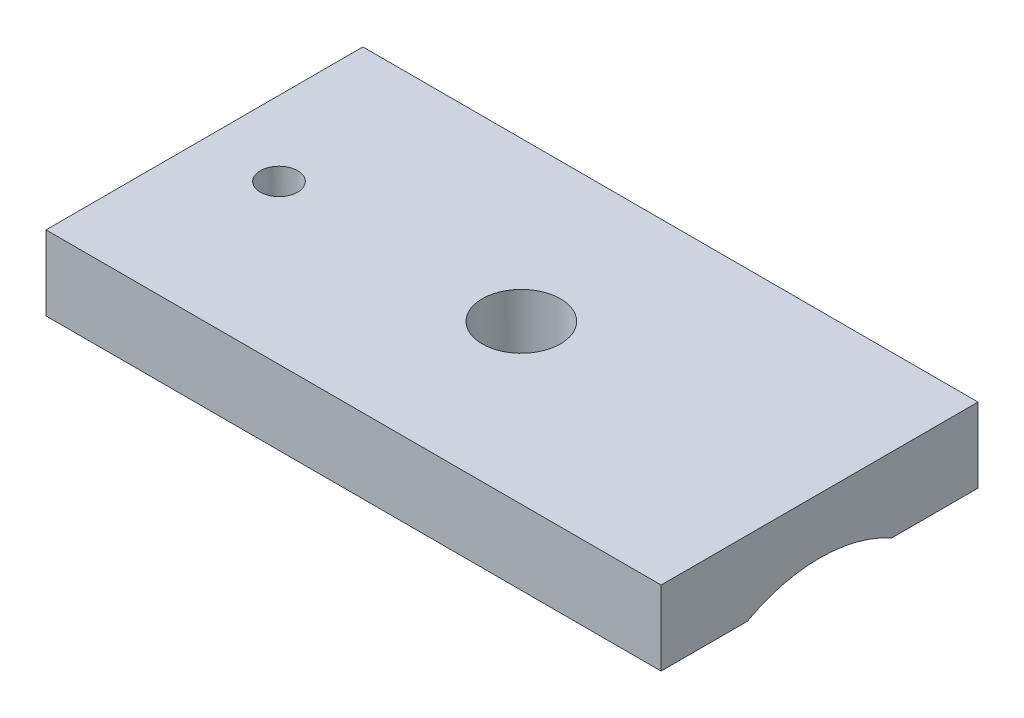
ISO-10303-21;
HEADER;
FILE_DESCRIPTION(('STEP AP214'),'2;1');
FILE_NAME('part.step','',(''),(''),'','','');
FILE_SCHEMA(('AUTOMOTIVE_DESIGN { 1 0 10303 214 1 1 1 1 }'));
ENDSEC;
DATA;
#1=APPLICATION_CONTEXT('core data for automotive mechanical design processes');
#2=APPLICATION_PROTOCOL_DEFINITION('international standard','automotive_design',2000,#1);
#3=PRODUCT_CONTEXT('',#1,'mechanical');
#4=PRODUCT('Part','Part','',(#3));
#5=PRODUCT_RELATED_PRODUCT_CATEGORY('part','',(#4));
#6=PRODUCT_DEFINITION_FORMATION('','',#4);
#7=PRODUCT_DEFINITION_CONTEXT('part definition',#1,'design');
#8=PRODUCT_DEFINITION('design','',#6,#7);
#9=PRODUCT_DEFINITION_SHAPE('','',#8);
#10=(LENGTH_UNIT() NAMED_UNIT(*) SI_UNIT(.MILLI.,.METRE.));
#11=(NAMED_UNIT(*) PLANE_ANGLE_UNIT() SI_UNIT($,.RADIAN.));
#12=(NAMED_UNIT(*) SI_UNIT($,.STERADIAN.) SOLID_ANGLE_UNIT());
#13=UNCERTAINTY_MEASURE_WITH_UNIT(LENGTH_MEASURE(1.E-05),#10,'distance_accuracy_value','');
#14=(GEOMETRIC_REPRESENTATION_CONTEXT(3) GLOBAL_UNCERTAINTY_ASSIGNED_CONTEXT((#13)) GLOBAL_UNIT_ASSIGNED_CONTEXT((#10,
#11,#12)) REPRESENTATION_CONTEXT('',''));
#15=CARTESIAN_POINT('',(0.,0.,0.));
#16=DIRECTION('',(0.,0.,1.));
#17=DIRECTION('',(1.,0.,0.));
#18=AXIS2_PLACEMENT_3D('',#15,#16,#17);
#19=CARTESIAN_POINT('',(0.,-2.,0.));
#20=DIRECTION('',(0.,1.,0.));
#21=DIRECTION('',(0.,0.,1.));
#22=AXIS2_PLACEMENT_3D('',#19,#20,#21);
#23=PLANE('',#22);
#24=DIRECTION('',(0.,0.,1.));
#25=VECTOR('',#24,1.);
#26=CARTESIAN_POINT('',(-16.5,-2.,8.50000000000001));
#27=LINE('',#26,#25);
#28=CARTESIAN_POINT('',(-16.5,-2.,3.87298334620742));
#29=VERTEX_POINT('',#28);
#30=CARTESIAN_POINT('',(-16.5,-2.,8.50000000000001));
#31=VERTEX_POINT('',#30);
#32=EDGE_CURVE('E115',#29,#31,#27,.T.);
#33=ORIENTED_EDGE('',*,*,#32,.F.);
#34=DIRECTION('',(1.,0.,0.));
#35=VECTOR('',#34,1.);
#36=CARTESIAN_POINT('',(-16.5,-2.,3.87298334620742));
#37=LINE('',#36,#35);
#38=CARTESIAN_POINT('',(16.5,-2.,3.87298334620742));
#39=VERTEX_POINT('',#38);
#40=EDGE_CURVE('E101',#29,#39,#37,.T.);
#41=ORIENTED_EDGE('',*,*,#40,.T.);
#42=DIRECTION('',(0.,0.,-1.));
#43=VECTOR('',#42,1.);
#44=CARTESIAN_POINT('',(16.5,-2.,8.5));
#45=LINE('',#44,#43);
#46=CARTESIAN_POINT('',(16.5,-2.,8.5));
#47=VERTEX_POINT('',#46);
#48=EDGE_CURVE('E130',#47,#39,#45,.T.);
#49=ORIENTED_EDGE('',*,*,#48,.F.);
#50=DIRECTION('',(1.,0.,0.));
#51=VECTOR('',#50,1.);
#52=CARTESIAN_POINT('',(16.5,-2.,8.5));
#53=LINE('',#52,#51);
#54=EDGE_CURVE('E120',#31,#47,#53,.T.);
#55=ORIENTED_EDGE('',*,*,#54,.F.);
#56=EDGE_LOOP('',(#33,#41,#49,#55));
#57=FACE_BOUND('',#56,.T.);
#58=ADVANCED_FACE('F36',(#57),#23,.F.);
#59=CARTESIAN_POINT('',(-16.5,2.,8.50000000000001));
#60=DIRECTION('',(1.,0.,0.));
#61=DIRECTION('',(0.,0.,-1.));
#62=AXIS2_PLACEMENT_3D('',#59,#60,#61);
#63=PLANE('',#62);
#64=CARTESIAN_POINT('',(-16.5,-2.,-8.49999999999999));
#65=VERTEX_POINT('',#64);
#66=CARTESIAN_POINT('',(-16.5,-2.,-3.87298334620742));
#67=VERTEX_POINT('',#66);
#68=EDGE_CURVE('E118',#65,#67,#27,.T.);
#69=ORIENTED_EDGE('',*,*,#68,.T.);
#70=CARTESIAN_POINT('',(-16.5,-9.,0.));
#71=DIRECTION('',(1.,0.,0.));
#72=DIRECTION('',(0.,0.,-1.));
#73=AXIS2_PLACEMENT_3D('',#70,#71,#72);
#74=CIRCLE('',#73,8.);
#75=EDGE_CURVE('E56',#67,#29,#74,.T.);
#76=ORIENTED_EDGE('',*,*,#75,.T.);
#77=ORIENTED_EDGE('',*,*,#32,.T.);
#78=DIRECTION('',(0.,-1.,0.));
#79=VECTOR('',#78,1.);
#80=CARTESIAN_POINT('',(-16.5,2.,8.50000000000001));
#81=LINE('',#80,#79);
#82=CARTESIAN_POINT('',(-16.5,2.,8.50000000000001));
#83=VERTEX_POINT('',#82);
#84=EDGE_CURVE('E11',#83,#31,#81,.T.);
#85=ORIENTED_EDGE('',*,*,#84,.F.);
#86=DIRECTION('',(0.,0.,1.));
#87=VECTOR('',#86,1.);
#88=CARTESIAN_POINT('',(-16.5,2.,8.50000000000001));
#89=LINE('',#88,#87);
#90=CARTESIAN_POINT('',(-16.5,2.,-8.49999999999999));
#91=VERTEX_POINT('',#90);
#92=EDGE_CURVE('E133',#91,#83,#89,.T.);
#93=ORIENTED_EDGE('',*,*,#92,.F.);
#94=DIRECTION('',(0.,-1.,0.));
#95=VECTOR('',#94,1.);
#96=CARTESIAN_POINT('',(-16.5,2.,-8.49999999999999));
#97=LINE('',#96,#95);
#98=EDGE_CURVE('E134',#91,#65,#97,.T.);
#99=ORIENTED_EDGE('',*,*,#98,.T.);
#100=EDGE_LOOP('',(#69,#76,#77,#85,#93,#99));
#101=FACE_BOUND('',#100,.T.);
#102=ADVANCED_FACE('F38',(#101),#63,.F.);
#103=CARTESIAN_POINT('',(16.5,2.,8.5));
#104=DIRECTION('',(0.,0.,-1.));
#105=DIRECTION('',(-1.,0.,0.));
#106=AXIS2_PLACEMENT_3D('',#103,#104,#105);
#107=PLANE('',#106);
#108=ORIENTED_EDGE('',*,*,#54,.T.);
#109=DIRECTION('',(0.,-1.,0.));
#110=VECTOR('',#109,1.);
#111=CARTESIAN_POINT('',(16.5,2.,8.5));
#112=LINE('',#111,#110);
#113=CARTESIAN_POINT('',(16.5,2.,8.5));
#114=VERTEX_POINT('',#113);
#115=EDGE_CURVE('E49',#114,#47,#112,.T.);
#116=ORIENTED_EDGE('',*,*,#115,.F.);
#117=DIRECTION('',(1.,0.,0.));
#118=VECTOR('',#117,1.);
#119=CARTESIAN_POINT('',(16.5,2.,8.5));
#120=LINE('',#119,#118);
#121=EDGE_CURVE('E93',#83,#114,#120,.T.);
#122=ORIENTED_EDGE('',*,*,#121,.F.);
#123=ORIENTED_EDGE('',*,*,#84,.T.);
#124=EDGE_LOOP('',(#108,#116,#122,#123));
#125=FACE_BOUND('',#124,.T.);
#126=ADVANCED_FACE('F144',(#125),#107,.F.);
#127=CARTESIAN_POINT('',(16.5,2.,8.5));
#128=DIRECTION('',(-1.,0.,0.));
#129=DIRECTION('',(0.,0.,1.));
#130=AXIS2_PLACEMENT_3D('',#127,#128,#129);
#131=PLANE('',#130);
#132=ORIENTED_EDGE('',*,*,#48,.T.);
#133=CARTESIAN_POINT('',(16.5,-9.,0.));
#134=DIRECTION('',(1.,0.,0.));
#135=DIRECTION('',(0.,0.,-1.));
#136=AXIS2_PLACEMENT_3D('',#133,#134,#135);
#137=CIRCLE('',#136,8.);
#138=CARTESIAN_POINT('',(16.5,-2.,-3.87298334620742));
#139=VERTEX_POINT('',#138);
#140=EDGE_CURVE('E104',#139,#39,#137,.T.);
#141=ORIENTED_EDGE('',*,*,#140,.F.);
#142=CARTESIAN_POINT('',(16.5,-2.,-8.5));
#143=VERTEX_POINT('',#142);
#144=EDGE_CURVE('E129',#139,#143,#45,.T.);
#145=ORIENTED_EDGE('',*,*,#144,.T.);
#146=DIRECTION('',(0.,-1.,0.));
#147=VECTOR('',#146,1.);
#148=CARTESIAN_POINT('',(16.5,2.,-8.5));
#149=LINE('',#148,#147);
#150=CARTESIAN_POINT('',(16.5,2.,-8.5));
#151=VERTEX_POINT('',#150);
#152=EDGE_CURVE('E136',#151,#143,#149,.T.);
#153=ORIENTED_EDGE('',*,*,#152,.F.);
#154=DIRECTION('',(0.,0.,-1.));
#155=VECTOR('',#154,1.);
#156=CARTESIAN_POINT('',(16.5,2.,8.5));
#157=LINE('',#156,#155);
#158=EDGE_CURVE('E143',#114,#151,#157,.T.);
#159=ORIENTED_EDGE('',*,*,#158,.F.);
#160=ORIENTED_EDGE('',*,*,#115,.T.);
#161=EDGE_LOOP('',(#132,#141,#145,#153,#159,#160));
#162=FACE_BOUND('',#161,.T.);
#163=ADVANCED_FACE('F141',(#162),#131,.F.);
#164=CARTESIAN_POINT('',(16.5,2.,-8.5));
#165=DIRECTION('',(0.,0.,1.));
#166=DIRECTION('',(1.,0.,0.));
#167=AXIS2_PLACEMENT_3D('',#164,#165,#166);
#168=PLANE('',#167);
#169=DIRECTION('',(-1.,0.,0.));
#170=VECTOR('',#169,1.);
#171=CARTESIAN_POINT('',(16.5,-2.,-8.5));
#172=LINE('',#171,#170);
#173=EDGE_CURVE('E86',#143,#65,#172,.T.);
#174=ORIENTED_EDGE('',*,*,#173,.T.);
#175=ORIENTED_EDGE('',*,*,#98,.F.);
#176=DIRECTION('',(-1.,0.,0.));
#177=VECTOR('',#176,1.);
#178=CARTESIAN_POINT('',(16.5,2.,-8.5));
#179=LINE('',#178,#177);
#180=EDGE_CURVE('E65',#151,#91,#179,.T.);
#181=ORIENTED_EDGE('',*,*,#180,.F.);
#182=ORIENTED_EDGE('',*,*,#152,.T.);
#183=EDGE_LOOP('',(#174,#175,#181,#182));
#184=FACE_BOUND('',#183,.T.);
#185=ADVANCED_FACE('F151',(#184),#168,.F.);
#186=CARTESIAN_POINT('',(0.,2.,0.));
#187=DIRECTION('',(0.,1.,0.));
#188=DIRECTION('',(0.,0.,1.));
#189=AXIS2_PLACEMENT_3D('',#186,#187,#188);
#190=PLANE('',#189);
#191=CARTESIAN_POINT('',(-12.5,2.,0.));
#192=DIRECTION('',(0.,1.,0.));
#193=DIRECTION('',(0.,0.,1.));
#194=AXIS2_PLACEMENT_3D('',#191,#192,#193);
#195=CIRCLE('',#194,0.999999999999999);
#196=CARTESIAN_POINT('',(-12.5,2.,1.));
#197=VERTEX_POINT('',#196);
#198=EDGE_CURVE('E109',#197,#197,#195,.T.);
#199=ORIENTED_EDGE('',*,*,#198,.F.);
#200=EDGE_LOOP('',(#199));
#201=FACE_BOUND('',#200,.T.);
#202=CARTESIAN_POINT('',(0.500000000000004,2.,0.));
#203=DIRECTION('',(0.,1.,0.));
#204=DIRECTION('',(0.,0.,1.));
#205=AXIS2_PLACEMENT_3D('',#202,#203,#204);
#206=CIRCLE('',#205,2.09999999999999);
#207=CARTESIAN_POINT('',(0.500000000000004,2.,2.09999999999999));
#208=VERTEX_POINT('',#207);
#209=EDGE_CURVE('E121',#208,#208,#206,.T.);
#210=ORIENTED_EDGE('',*,*,#209,.F.);
#211=EDGE_LOOP('',(#210));
#212=FACE_BOUND('',#211,.T.);
#213=ORIENTED_EDGE('',*,*,#92,.T.);
#214=ORIENTED_EDGE('',*,*,#121,.T.);
#215=ORIENTED_EDGE('',*,*,#158,.T.);
#216=ORIENTED_EDGE('',*,*,#180,.T.);
#217=EDGE_LOOP('',(#213,#214,#215,#216));
#218=FACE_BOUND('',#217,.T.);
#219=ADVANCED_FACE('F149',(#201,#212,#218),#190,.T.);
#220=ORIENTED_EDGE('',*,*,#144,.F.);
#221=DIRECTION('',(1.,0.,0.));
#222=VECTOR('',#221,1.);
#223=CARTESIAN_POINT('',(-16.5,-2.,-3.87298334620742));
#224=LINE('',#223,#222);
#225=EDGE_CURVE('E110',#139,#67,#224,.F.);
#226=ORIENTED_EDGE('',*,*,#225,.T.);
#227=ORIENTED_EDGE('',*,*,#68,.F.);
#228=ORIENTED_EDGE('',*,*,#173,.F.);
#229=EDGE_LOOP('',(#220,#226,#227,#228));
#230=FACE_BOUND('',#229,.T.);
#231=ADVANCED_FACE('F158',(#230),#23,.F.);
#232=CARTESIAN_POINT('',(0.500000000000004,2.,0.));
#233=DIRECTION('',(0.,1.,0.));
#234=DIRECTION('',(0.,0.,1.));
#235=AXIS2_PLACEMENT_3D('',#232,#233,#234);
#236=CYLINDRICAL_SURFACE('',#235,2.09999999999999);
#237=CARTESIAN_POINT('',(0.500000000000004,-1.28054406062189,2.1));
#238=CARTESIAN_POINT('',(0.384244036444389,-1.28054199289385,2.09999707473613));
#239=CARTESIAN_POINT('',(0.268456764800609,-1.27791190277968,2.09039636314271));
#240=CARTESIAN_POINT('',(0.0402213319274551,-1.26770600193519,2.05231700363292));
#241=CARTESIAN_POINT('',(-0.0722250540691906,-1.26012760930261,2.02382850041306));
#242=CARTESIAN_POINT('',(-0.290444139377346,-1.24094122296808,1.94897059999035));
#243=CARTESIAN_POINT('',(-0.39622579283404,-1.22933877819877,1.90262581584555));
#244=CARTESIAN_POINT('',(-0.598527860264478,-1.20341862280144,1.7934474875684));
#245=CARTESIAN_POINT('',(-0.695047636461395,-1.18910072538795,1.73061280904599));
#246=CARTESIAN_POINT('',(-0.878426002934152,-1.1589740833862,1.58860994430493));
#247=CARTESIAN_POINT('',(-0.965026849650537,-1.14313956422978,1.50911431584452));
#248=CARTESIAN_POINT('',(-1.12383259868933,-1.11198658136264,1.33675063329763));
#249=CARTESIAN_POINT('',(-1.19603604697778,-1.09666816990481,1.24388123018533));
#250=CARTESIAN_POINT('',(-1.32506701068487,-1.06798638252165,1.04562448703873));
#251=CARTESIAN_POINT('',(-1.38163906309443,-1.05465696081209,0.940065546246408));
#252=CARTESIAN_POINT('',(-1.47613660589614,-1.03175032353768,0.720526784755087));
#253=CARTESIAN_POINT('',(-1.51406513945266,-1.02217249565551,0.606548341859717));
#254=CARTESIAN_POINT('',(-1.56936702030414,-1.00803044797843,0.376095489313645));
#255=CARTESIAN_POINT('',(-1.5871786187437,-1.00335949598776,0.259732911149868));
#256=CARTESIAN_POINT('',(-1.60311903049435,-0.999184631570967,0.0255837766167599));
#257=CARTESIAN_POINT('',(-1.60125103986832,-0.999679880128121,-0.0922025454260017));
#258=CARTESIAN_POINT('',(-1.57819560022776,-1.00570309417096,-0.322808026990901));
#259=CARTESIAN_POINT('',(-1.55748152933033,-1.01110773954452,-0.435678224731679));
#260=CARTESIAN_POINT('',(-1.49808569776622,-1.02619745238614,-0.656280779447896));
#261=CARTESIAN_POINT('',(-1.4594029289234,-1.03588276002936,-0.764012847762441));
#262=CARTESIAN_POINT('',(-1.36479982001862,-1.05862992783276,-0.972499347218089));
#263=CARTESIAN_POINT('',(-1.30871569136852,-1.07172367254667,-1.07317583565336));
#264=CARTESIAN_POINT('',(-1.18102721567551,-1.09987446363358,-1.2638510030401));
#265=CARTESIAN_POINT('',(-1.10941992523664,-1.11493188212897,-1.35384765193857));
#266=CARTESIAN_POINT('',(-0.9501985019811,-1.145904848007,-1.52343345893341));
#267=CARTESIAN_POINT('',(-0.862171280857282,-1.1618325971182,-1.60263299028554));
#268=CARTESIAN_POINT('',(-0.67391918361954,-1.19234512187321,-1.74523874501544));
#269=CARTESIAN_POINT('',(-0.573693611084516,-1.20692982075681,-1.80864406604926));
#270=CARTESIAN_POINT('',(-0.363065671154063,-1.23315255818655,-1.91814596123527));
#271=CARTESIAN_POINT('',(-0.252607519594032,-1.24477297040888,-1.9641397507302));
#272=CARTESIAN_POINT('',(-0.0251459418825064,-1.26353073960771,-2.03677840582365));
#273=CARTESIAN_POINT('',(0.0918559115342486,-1.27066916879885,-2.06342789935258));
#274=CARTESIAN_POINT('',(0.325447544914274,-1.27942716060403,-2.09595627149112));
#275=CARTESIAN_POINT('',(0.441950888230916,-1.2812007574936,-2.1024150501721));
#276=CARTESIAN_POINT('',(0.674372351266092,-1.27944915594473,-2.09597379610166));
#277=CARTESIAN_POINT('',(0.79029052985709,-1.27592450166249,-2.0830757513905));
#278=CARTESIAN_POINT('',(1.01603767109569,-1.26412202522006,-2.03879751670138));
#279=CARTESIAN_POINT('',(1.12593955837528,-1.25593319983942,-2.00776310506137));
#280=CARTESIAN_POINT('',(1.33897899640301,-1.2358113733002,-1.92848048864147));
#281=CARTESIAN_POINT('',(1.44211568227565,-1.22387789454192,-1.88023008799636));
#282=CARTESIAN_POINT('',(1.64113113397085,-1.1972931261028,-1.76669856654639));
#283=CARTESIAN_POINT('',(1.73680754107992,-1.18258917687429,-1.7010753329136));
#284=CARTESIAN_POINT('',(1.91600335988844,-1.15224546578228,-1.55508718228025));
#285=CARTESIAN_POINT('',(1.99952055487049,-1.13660553401352,-1.47471958328993));
#286=CARTESIAN_POINT('',(2.15441955089564,-1.10562390108157,-1.29884707276605));
#287=CARTESIAN_POINT('',(2.22539777564263,-1.09030269400789,-1.20298239664879));
#288=CARTESIAN_POINT('',(2.35025276100979,-1.06213355744214,-1.00036125337229));
#289=CARTESIAN_POINT('',(2.40413042989029,-1.04928549660833,-0.893605365075157));
#290=CARTESIAN_POINT('',(2.49276634742377,-1.02759280815052,-0.672982125972822));
#291=CARTESIAN_POINT('',(2.52766628998734,-1.01871860093986,-0.559174749154928));
#292=CARTESIAN_POINT('',(2.57777115545529,-1.0058434825579,-0.327043838154112));
#293=CARTESIAN_POINT('',(2.59298029770434,-1.0018415273714,-0.20872127708094));
#294=CARTESIAN_POINT('',(2.60301433874781,-0.99920942076269,0.025305610087539));
#295=CARTESIAN_POINT('',(2.59843212598296,-1.00042302170661,0.140983124369889));
#296=CARTESIAN_POINT('',(2.57038539500615,-1.00773407249868,0.369859783733969));
#297=CARTESIAN_POINT('',(2.54692154691413,-1.01383134902239,0.483059016624856));
#298=CARTESIAN_POINT('',(2.4821085817812,-1.0301953611199,0.703076189675705));
#299=CARTESIAN_POINT('',(2.4408764378317,-1.04043480124888,0.809930751992969));
#300=CARTESIAN_POINT('',(2.34180205992632,-1.06401058048474,1.01526605490021));
#301=CARTESIAN_POINT('',(2.28395755356404,-1.07734734322683,1.11374564748708));
#302=CARTESIAN_POINT('',(2.15154658093999,-1.10612059650934,1.30230900329198));
#303=CARTESIAN_POINT('',(2.07658464606109,-1.12160264386765,1.39210809929374));
#304=CARTESIAN_POINT('',(1.9128212896994,-1.15273209658347,1.55805327814374));
#305=CARTESIAN_POINT('',(1.82401626752083,-1.16837954397293,1.63419579769615));
#306=CARTESIAN_POINT('',(1.6328304414933,-1.19844763585288,1.7722554763967));
#307=CARTESIAN_POINT('',(1.53020250369154,-1.21283538578907,1.83383818728454));
#308=CARTESIAN_POINT('',(1.3156850713263,-1.23829645964887,1.93878677197136));
#309=CARTESIAN_POINT('',(1.20380187233855,-1.24937201329594,1.98216490880073));
#310=CARTESIAN_POINT('',(0.993561632742088,-1.26536703574557,2.04359353219274));
#311=CARTESIAN_POINT('',(0.896141194063868,-1.27101321112778,2.06469722265965));
#312=CARTESIAN_POINT('',(0.699154742253011,-1.27860241659138,2.09290097205146));
#313=CARTESIAN_POINT('',(0.599588957890992,-1.2805458395616,2.10000251670817));
#314=CARTESIAN_POINT('',(0.500000000000004,-1.28054406062189,2.1));
#315=B_SPLINE_CURVE_WITH_KNOTS('',3,(#237,#238,#239,#240,#241,#242,#243,#244,#245,#246,#247,
#248,#249,#250,#251,#252,#253,#254,#255,#256,#257,#258,#259,#260,#261,#262,#263,#264,#265,#266,
#267,#268,#269,#270,#271,#272,#273,#274,#275,#276,#277,#278,#279,#280,#281,#282,#283,#284,#285,
#286,#287,#288,#289,#290,#291,#292,#293,#294,#295,#296,#297,#298,#299,#300,#301,#302,#303,#304,
#305,#306,#307,#308,#309,#310,#311,#312,#313,#314),.UNSPECIFIED.,.T.,.F.,(4,2,2,2,2,2,2,2,2,2,2,
2,2,2,2,2,2,2,2,2,2,2,2,2,2,2,2,2,2,2,2,2,2,2,2,2,2,2,4),(0.,0.346901812495411,
0.693984774601702,1.04059102006554,1.38722111588191,1.74143920947592,2.0956930584579,
2.45543360174609,2.81511540540189,3.16680047974519,3.51842843956861,3.8614608951439,
4.20451259968872,4.55089656276601,4.89734626234308,5.25411055949775,5.61089523439248,
5.96975442024492,6.32852772428482,6.6768972656967,7.02523103030441,7.36713083024464,
7.70907425442379,8.05832960560819,8.40764854919864,8.76671324559394,9.12575886782476,
9.48208558579399,9.83833593743033,10.1839893363922,10.52963046846,10.8730301112332,
11.2164767500635,11.5688480068,11.9213110714784,12.2812190642816,12.6408842239052,
12.9393678205879,13.237819744236),.UNSPECIFIED.);
#316=CARTESIAN_POINT('',(0.500000000000004,-1.28054406062189,2.1));
#317=VERTEX_POINT('',#316);
#318=EDGE_CURVE('E176',#317,#317,#315,.T.);
#319=ORIENTED_EDGE('',*,*,#318,.T.);
#320=EDGE_LOOP('',(#319));
#321=FACE_BOUND('',#320,.T.);
#322=ORIENTED_EDGE('',*,*,#209,.T.);
#323=EDGE_LOOP('',(#322));
#324=FACE_BOUND('',#323,.T.);
#325=ADVANCED_FACE('F168',(#321,#324),#236,.F.);
#326=CARTESIAN_POINT('',(-12.5,2.,0.));
#327=DIRECTION('',(0.,1.,0.));
#328=DIRECTION('',(0.,0.,1.));
#329=AXIS2_PLACEMENT_3D('',#326,#327,#328);
#330=CYLINDRICAL_SURFACE('',#329,0.999999999999999);
#331=CARTESIAN_POINT('',(-12.5,-1.06274606680623,1.));
#332=CARTESIAN_POINT('',(-12.5559345135167,-1.06274526331469,0.99999762193358));
#333=CARTESIAN_POINT('',(-12.6119039859619,-1.06214841952422,0.995291159608515));
#334=CARTESIAN_POINT('',(-12.7222852901618,-1.05982643608012,0.976590565488537));
#335=CARTESIAN_POINT('',(-12.7766954321988,-1.05810011742815,0.962586728436518));
#336=CARTESIAN_POINT('',(-12.8823439528464,-1.05371770489829,0.925710677130385));
#337=CARTESIAN_POINT('',(-12.9335844568475,-1.0510622421854,0.902844481919298));
#338=CARTESIAN_POINT('',(-13.0314913807292,-1.04512150592037,0.848905679371814));
#339=CARTESIAN_POINT('',(-13.0781585806972,-1.04183634006287,0.817834474949919));
#340=CARTESIAN_POINT('',(-13.1658648988488,-1.0349857630244,0.748181380105769));
#341=CARTESIAN_POINT('',(-13.2068747209275,-1.03141903319183,0.70956272600972));
#342=CARTESIAN_POINT('',(-13.2818491075756,-1.02441906849667,0.625990104268493));
#343=CARTESIAN_POINT('',(-13.3158133216379,-1.02098584028247,0.581035821623215));
#344=CARTESIAN_POINT('',(-13.3758374318025,-1.01462622154871,0.48588393227039));
#345=CARTESIAN_POINT('',(-13.4018708180399,-1.01170154461278,0.435669478224448));
#346=CARTESIAN_POINT('',(-13.4451244799764,-1.00670305218189,0.331538687222369));
#347=CARTESIAN_POINT('',(-13.4623450827706,-1.00462920510813,0.277622487744365));
#348=CARTESIAN_POINT('',(-13.4873968273338,-1.00157532517509,0.167918275100448));
#349=CARTESIAN_POINT('',(-13.4952766714096,-1.00058962065624,0.112141543865354));
#350=CARTESIAN_POINT('',(-13.5015741540146,-0.999803721083133,4.92802746218491E-05));
#351=CARTESIAN_POINT('',(-13.499992164781,-1.00000347939169,-0.0562662307979051));
#352=CARTESIAN_POINT('',(-13.487449918897,-1.00156140891996,-0.167506107589816));
#353=CARTESIAN_POINT('',(-13.4765420406074,-1.00291311017709,-0.222436482305778));
#354=CARTESIAN_POINT('',(-13.445739529348,-1.00661577623067,-0.329680865562147));
#355=CARTESIAN_POINT('',(-13.4258447255333,-1.00896676002382,-0.381994824342479));
#356=CARTESIAN_POINT('',(-13.3775774028865,-1.01441496876835,-0.482683526175452));
#357=CARTESIAN_POINT('',(-13.3491822169079,-1.01751418462705,-0.531047291136204));
#358=CARTESIAN_POINT('',(-13.2847366551136,-1.02411212373887,-0.622342980922588));
#359=CARTESIAN_POINT('',(-13.2486859282126,-1.02761086531095,-0.66527465648694));
#360=CARTESIAN_POINT('',(-13.1696592725606,-1.03464452990595,-0.744795212309175));
#361=CARTESIAN_POINT('',(-13.1266376961813,-1.03817953678109,-0.781338735998395));
#362=CARTESIAN_POINT('',(-13.035047377287,-1.04486371223768,-0.846693140250039));
#363=CARTESIAN_POINT('',(-12.9864786173848,-1.04801287960968,-0.875503996574035));
#364=CARTESIAN_POINT('',(-12.8851322017751,-1.05356878954913,-0.924577829433091));
#365=CARTESIAN_POINT('',(-12.8323527680187,-1.05597521636748,-0.944837171944928));
#366=CARTESIAN_POINT('',(-12.7241042185893,-1.05976703001617,-0.976192661787233));
#367=CARTESIAN_POINT('',(-12.6686352326765,-1.06115246605319,-0.987289250719845));
#368=CARTESIAN_POINT('',(-12.5569827272001,-1.0627364448638,-0.999944172763441));
#369=CARTESIAN_POINT('',(-12.5008065507645,-1.0629429302305,-1.00156633679931));
#370=CARTESIAN_POINT('',(-12.3889832281338,-1.06216663552141,-0.995394781292222));
#371=CARTESIAN_POINT('',(-12.3333360706883,-1.0611838807942,-0.987601262443922));
#372=CARTESIAN_POINT('',(-12.2243416945689,-1.05814708606406,-0.96287331431909));
#373=CARTESIAN_POINT('',(-12.1709873539238,-1.05609666922136,-0.945969793498423));
#374=CARTESIAN_POINT('',(-12.0678703380587,-1.05115852011677,-0.90353348764645));
#375=CARTESIAN_POINT('',(-12.0181077891037,-1.04827075843695,-0.878000399432489));
#376=CARTESIAN_POINT('',(-11.9232981424748,-1.04196427458706,-0.818872808861967));
#377=CARTESIAN_POINT('',(-11.8782773338742,-1.03854282905167,-0.785236447830842));
#378=CARTESIAN_POINT('',(-11.794497378426,-1.03156304179591,-0.710916296947582));
#379=CARTESIAN_POINT('',(-11.7557384752528,-1.02800469475485,-0.670232232970194));
#380=CARTESIAN_POINT('',(-11.6853583250662,-1.02112764525216,-0.582692710223409));
#381=CARTESIAN_POINT('',(-11.653779021282,-1.01781042434992,-0.535803396846814));
#382=CARTESIAN_POINT('',(-11.5989447129465,-1.01181154787356,-0.437349032672716));
#383=CARTESIAN_POINT('',(-11.5756895406076,-1.00912987948914,-0.385784076147329));
#384=CARTESIAN_POINT('',(-11.5382328852368,-1.00471083738725,-0.279581543655782));
#385=CARTESIAN_POINT('',(-11.5240071615874,-1.00297093724918,-0.224952626604711));
#386=CARTESIAN_POINT('',(-11.5049343643093,-1.00062098128974,-0.114058422911184));
#387=CARTESIAN_POINT('',(-11.5000868677603,-1.00001087451929,-0.0577932101752431));
#388=CARTESIAN_POINT('',(-11.4999160310831,-0.999989487945342,0.0543668733375131));
#389=CARTESIAN_POINT('',(-11.5045280157728,-1.00057006732864,0.110261655085893));
#390=CARTESIAN_POINT('',(-11.5230082453723,-1.00284863536825,0.220475096581045));
#391=CARTESIAN_POINT('',(-11.5368764838447,-1.00454662324742,0.274793757423939));
#392=CARTESIAN_POINT('',(-11.5734552457399,-1.00887005915187,0.380304577194926));
#393=CARTESIAN_POINT('',(-11.5961626717493,-1.01149518226212,0.431497824063828));
#394=CARTESIAN_POINT('',(-11.649768525843,-1.01738220957488,0.529357334857609));
#395=CARTESIAN_POINT('',(-11.6806670513047,-1.02064412134752,0.576023544955211));
#396=CARTESIAN_POINT('',(-11.7500172861346,-1.02746722429769,0.663834707185023));
#397=CARTESIAN_POINT('',(-11.7885171174095,-1.03103023488432,0.70494151513372));
#398=CARTESIAN_POINT('',(-11.8718771776115,-1.03803936394584,0.780136447527739));
#399=CARTESIAN_POINT('',(-11.9167389109964,-1.04148545453201,0.814222907117396));
#400=CARTESIAN_POINT('',(-12.0117479690789,-1.04788475442125,0.874522097006414));
#401=CARTESIAN_POINT('',(-12.061915035974,-1.05083600899087,0.900703913266694));
#402=CARTESIAN_POINT('',(-12.1659426962379,-1.05588856752151,0.944234115337341));
#403=CARTESIAN_POINT('',(-12.2197991997214,-1.05799079538449,0.961592108491325));
#404=CARTESIAN_POINT('',(-12.3116119948174,-1.06059685272063,0.982826358495191));
#405=CARTESIAN_POINT('',(-12.348989180615,-1.06139879391236,0.989257212404232));
#406=CARTESIAN_POINT('',(-12.4242388999868,-1.06247367108035,0.997844822362205));
#407=CARTESIAN_POINT('',(-12.4621114298004,-1.06274661107029,1.00000161083973));
#408=CARTESIAN_POINT('',(-12.5,-1.06274606680623,1.));
#409=B_SPLINE_CURVE_WITH_KNOTS('',3,(#331,#332,#333,#334,#335,#336,#337,#338,#339,#340,#341,
#342,#343,#344,#345,#346,#347,#348,#349,#350,#351,#352,#353,#354,#355,#356,#357,#358,#359,#360,
#361,#362,#363,#364,#365,#366,#367,#368,#369,#370,#371,#372,#373,#374,#375,#376,#377,#378,#379,
#380,#381,#382,#383,#384,#385,#386,#387,#388,#389,#390,#391,#392,#393,#394,#395,#396,#397,#398,
#399,#400,#401,#402,#403,#404,#405,#406,#407,#408),.UNSPECIFIED.,.T.,.F.,(4,2,2,2,2,2,2,2,2,2,2,
2,2,2,2,2,2,2,2,2,2,2,2,2,2,2,2,2,2,2,2,2,2,2,2,2,2,2,4),(0.,0.167665126991696,
0.335505550460951,0.503232181032475,0.670930151802448,0.839466310196262,1.00801085097031,
1.17711274458296,1.34620836135932,1.51441838776583,1.68262179668043,1.84988665973215,
2.01715470268715,2.18487281765121,2.35259862587642,2.52147078951108,2.6903434824777,
2.85928786695603,3.02822410862475,3.19602087122353,3.36381405730846,3.53104150517093,
3.69827482884741,3.86639127817644,4.03451426797924,4.20359554356937,4.37267341083551,
4.54129542713976,4.70990983909124,4.87737526515302,5.04484057474715,5.21224725417636,
5.37965592385699,5.54816051556334,5.71670502175931,5.88590039081933,6.05491114392806,
6.1684839585318,6.2820559114219),.UNSPECIFIED.);
#410=CARTESIAN_POINT('',(-12.5,-1.06274606680623,1.));
#411=VERTEX_POINT('',#410);
#412=EDGE_CURVE('E40',#411,#411,#409,.T.);
#413=ORIENTED_EDGE('',*,*,#412,.T.);
#414=EDGE_LOOP('',(#413));
#415=FACE_BOUND('',#414,.T.);
#416=ORIENTED_EDGE('',*,*,#198,.T.);
#417=EDGE_LOOP('',(#416));
#418=FACE_BOUND('',#417,.T.);
#419=ADVANCED_FACE('F173',(#415,#418),#330,.F.);
#420=CARTESIAN_POINT('',(-16.5,-9.,0.));
#421=DIRECTION('',(1.,0.,0.));
#422=DIRECTION('',(0.,0.,-1.));
#423=AXIS2_PLACEMENT_3D('',#420,#421,#422);
#424=CYLINDRICAL_SURFACE('',#423,8.);
#425=ORIENTED_EDGE('',*,*,#412,.F.);
#426=EDGE_LOOP('',(#425));
#427=FACE_BOUND('',#426,.T.);
#428=ORIENTED_EDGE('',*,*,#318,.F.);
#429=EDGE_LOOP('',(#428));
#430=FACE_BOUND('',#429,.T.);
#431=ORIENTED_EDGE('',*,*,#75,.F.);
#432=ORIENTED_EDGE('',*,*,#225,.F.);
#433=ORIENTED_EDGE('',*,*,#140,.T.);
#434=ORIENTED_EDGE('',*,*,#40,.F.);
#435=EDGE_LOOP('',(#431,#432,#433,#434));
#436=FACE_BOUND('',#435,.T.);
#437=ADVANCED_FACE('F102',(#427,#430,#436),#424,.F.);
#438=CLOSED_SHELL('',(#58,#102,#126,#163,#185,#219,#231,#325,#419,#437));
#439=MANIFOLD_SOLID_BREP('B2',#438);
#440=ADVANCED_BREP_SHAPE_REPRESENTATION('',(#18,#439),#14);
#441=SHAPE_DEFINITION_REPRESENTATION(#9,#440);
ENDSEC;
END-ISO-10303-21;
